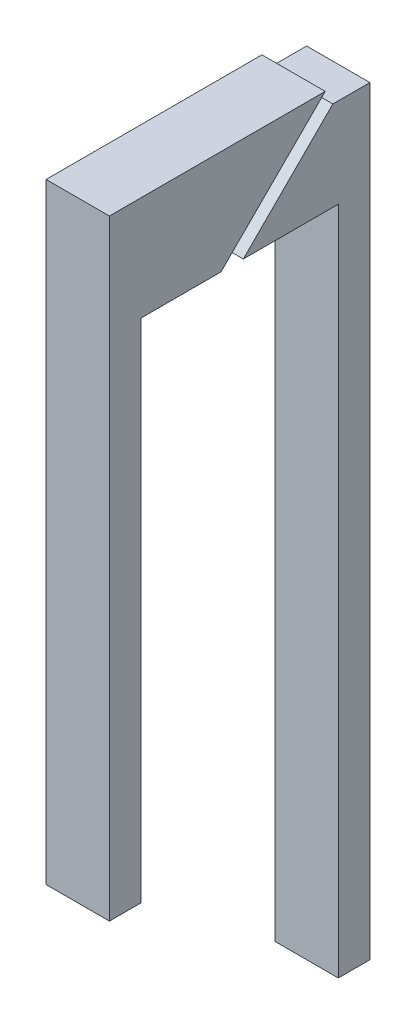
ISO-10303-21;
HEADER;
FILE_DESCRIPTION(('STEP AP214'),'2;1');
FILE_NAME('part.step','',(''),(''),'','','');
FILE_SCHEMA(('AUTOMOTIVE_DESIGN { 1 0 10303 214 1 1 1 1 }'));
ENDSEC;
DATA;
#1=APPLICATION_CONTEXT('core data for automotive mechanical design processes');
#2=APPLICATION_PROTOCOL_DEFINITION('international standard','automotive_design',2000,#1);
#3=PRODUCT_CONTEXT('',#1,'mechanical');
#4=PRODUCT('Part','Part','',(#3));
#5=PRODUCT_RELATED_PRODUCT_CATEGORY('part','',(#4));
#6=PRODUCT_DEFINITION_FORMATION('','',#4);
#7=PRODUCT_DEFINITION_CONTEXT('part definition',#1,'design');
#8=PRODUCT_DEFINITION('design','',#6,#7);
#9=PRODUCT_DEFINITION_SHAPE('','',#8);
#10=(LENGTH_UNIT() NAMED_UNIT(*) SI_UNIT(.MILLI.,.METRE.));
#11=(NAMED_UNIT(*) PLANE_ANGLE_UNIT() SI_UNIT($,.RADIAN.));
#12=(NAMED_UNIT(*) SI_UNIT($,.STERADIAN.) SOLID_ANGLE_UNIT());
#13=UNCERTAINTY_MEASURE_WITH_UNIT(LENGTH_MEASURE(1.E-05),#10,'distance_accuracy_value','');
#14=(GEOMETRIC_REPRESENTATION_CONTEXT(3) GLOBAL_UNCERTAINTY_ASSIGNED_CONTEXT((#13)) GLOBAL_UNIT_ASSIGNED_CONTEXT((#10,
#11,#12)) REPRESENTATION_CONTEXT('',''));
#15=CARTESIAN_POINT('',(0.,0.,0.));
#16=DIRECTION('',(0.,0.,1.));
#17=DIRECTION('',(1.,0.,0.));
#18=AXIS2_PLACEMENT_3D('',#15,#16,#17);
#19=CARTESIAN_POINT('',(1.,-32.4711166692554,-20.6743711676793));
#20=DIRECTION('',(0.,-1.,0.));
#21=DIRECTION('',(0.,0.,-1.));
#22=AXIS2_PLACEMENT_3D('',#19,#20,#21);
#23=PLANE('',#22);
#24=DIRECTION('',(0.,0.,1.));
#25=VECTOR('',#24,1.);
#26=CARTESIAN_POINT('',(0.,-32.4711166692554,-20.6743711676793));
#27=LINE('',#26,#25);
#28=CARTESIAN_POINT('',(0.,-32.4711166692554,-24.0837299023369));
#29=VERTEX_POINT('',#28);
#30=CARTESIAN_POINT('',(0.,-32.4711166692554,-20.6743711676793));
#31=VERTEX_POINT('',#30);
#32=EDGE_CURVE('E127',#29,#31,#27,.T.);
#33=ORIENTED_EDGE('',*,*,#32,.T.);
#34=DIRECTION('',(-1.,0.,0.));
#35=VECTOR('',#34,1.);
#36=CARTESIAN_POINT('',(1.,-32.4711166692554,-20.6743711676793));
#37=LINE('',#36,#35);
#38=CARTESIAN_POINT('',(1.,-32.4711166692554,-20.6743711676793));
#39=VERTEX_POINT('',#38);
#40=EDGE_CURVE('E12',#39,#31,#37,.T.);
#41=ORIENTED_EDGE('',*,*,#40,.F.);
#42=DIRECTION('',(0.,0.,1.));
#43=VECTOR('',#42,1.);
#44=CARTESIAN_POINT('',(1.,-32.4711166692554,-20.6743711676793));
#45=LINE('',#44,#43);
#46=CARTESIAN_POINT('',(1.,-32.4711166692554,-24.0837299023369));
#47=VERTEX_POINT('',#46);
#48=EDGE_CURVE('E137',#47,#39,#45,.T.);
#49=ORIENTED_EDGE('',*,*,#48,.F.);
#50=DIRECTION('',(-1.,0.,0.));
#51=VECTOR('',#50,1.);
#52=CARTESIAN_POINT('',(1.,-32.4711166692554,-24.0837299023369));
#53=LINE('',#52,#51);
#54=EDGE_CURVE('E123',#47,#29,#53,.T.);
#55=ORIENTED_EDGE('',*,*,#54,.T.);
#56=EDGE_LOOP('',(#33,#41,#49,#55));
#57=FACE_BOUND('',#56,.T.);
#58=ADVANCED_FACE('F43',(#57),#23,.F.);
#59=CARTESIAN_POINT('',(1.,-42.1175184791234,-20.6743711676793));
#60=DIRECTION('',(0.,0.,-1.));
#61=DIRECTION('',(-1.,0.,0.));
#62=AXIS2_PLACEMENT_3D('',#59,#60,#61);
#63=PLANE('',#62);
#64=DIRECTION('',(0.,-1.,0.));
#65=VECTOR('',#64,1.);
#66=CARTESIAN_POINT('',(0.,-42.1175184791234,-20.6743711676793));
#67=LINE('',#66,#65);
#68=CARTESIAN_POINT('',(0.,-42.1175184791234,-20.6743711676793));
#69=VERTEX_POINT('',#68);
#70=EDGE_CURVE('E130',#31,#69,#67,.T.);
#71=ORIENTED_EDGE('',*,*,#70,.T.);
#72=DIRECTION('',(-1.,0.,0.));
#73=VECTOR('',#72,1.);
#74=CARTESIAN_POINT('',(1.,-42.1175184791234,-20.6743711676793));
#75=LINE('',#74,#73);
#76=CARTESIAN_POINT('',(1.,-42.1175184791234,-20.6743711676793));
#77=VERTEX_POINT('',#76);
#78=EDGE_CURVE('E51',#77,#69,#75,.T.);
#79=ORIENTED_EDGE('',*,*,#78,.F.);
#80=DIRECTION('',(0.,-1.,0.));
#81=VECTOR('',#80,1.);
#82=CARTESIAN_POINT('',(1.,-42.1175184791234,-20.6743711676793));
#83=LINE('',#82,#81);
#84=EDGE_CURVE('E96',#39,#77,#83,.T.);
#85=ORIENTED_EDGE('',*,*,#84,.F.);
#86=ORIENTED_EDGE('',*,*,#40,.T.);
#87=EDGE_LOOP('',(#71,#79,#85,#86));
#88=FACE_BOUND('',#87,.T.);
#89=ADVANCED_FACE('F161',(#88),#63,.F.);
#90=CARTESIAN_POINT('',(1.,-42.1175184791234,-21.1743711676793));
#91=DIRECTION('',(0.,1.,0.));
#92=DIRECTION('',(0.,0.,1.));
#93=AXIS2_PLACEMENT_3D('',#90,#91,#92);
#94=PLANE('',#93);
#95=DIRECTION('',(0.,0.,-1.));
#96=VECTOR('',#95,1.);
#97=CARTESIAN_POINT('',(0.,-42.1175184791234,-21.1743711676793));
#98=LINE('',#97,#96);
#99=CARTESIAN_POINT('',(0.,-42.1175184791234,-21.1743711676793));
#100=VERTEX_POINT('',#99);
#101=EDGE_CURVE('E132',#69,#100,#98,.T.);
#102=ORIENTED_EDGE('',*,*,#101,.T.);
#103=DIRECTION('',(-1.,0.,0.));
#104=VECTOR('',#103,1.);
#105=CARTESIAN_POINT('',(1.,-42.1175184791234,-21.1743711676793));
#106=LINE('',#105,#104);
#107=CARTESIAN_POINT('',(1.,-42.1175184791234,-21.1743711676793));
#108=VERTEX_POINT('',#107);
#109=EDGE_CURVE('E118',#108,#100,#106,.T.);
#110=ORIENTED_EDGE('',*,*,#109,.F.);
#111=DIRECTION('',(0.,0.,-1.));
#112=VECTOR('',#111,1.);
#113=CARTESIAN_POINT('',(1.,-42.1175184791234,-21.1743711676793));
#114=LINE('',#113,#112);
#115=EDGE_CURVE('E109',#77,#108,#114,.T.);
#116=ORIENTED_EDGE('',*,*,#115,.F.);
#117=ORIENTED_EDGE('',*,*,#78,.T.);
#118=EDGE_LOOP('',(#102,#110,#116,#117));
#119=FACE_BOUND('',#118,.T.);
#120=ADVANCED_FACE('F143',(#119),#94,.F.);
#121=CARTESIAN_POINT('',(1.,-34.1175184791234,-21.1743711676793));
#122=DIRECTION('',(0.,0.,1.));
#123=DIRECTION('',(1.,0.,0.));
#124=AXIS2_PLACEMENT_3D('',#121,#122,#123);
#125=PLANE('',#124);
#126=DIRECTION('',(0.,1.,0.));
#127=VECTOR('',#126,1.);
#128=CARTESIAN_POINT('',(0.,-34.1175184791234,-21.1743711676793));
#129=LINE('',#128,#127);
#130=CARTESIAN_POINT('',(0.,-34.1175184791234,-21.1743711676793));
#131=VERTEX_POINT('',#130);
#132=EDGE_CURVE('E117',#100,#131,#129,.T.);
#133=ORIENTED_EDGE('',*,*,#132,.T.);
#134=DIRECTION('',(-1.,0.,0.));
#135=VECTOR('',#134,1.);
#136=CARTESIAN_POINT('',(1.,-34.1175184791234,-21.1743711676793));
#137=LINE('',#136,#135);
#138=CARTESIAN_POINT('',(1.,-34.1175184791234,-21.1743711676793));
#139=VERTEX_POINT('',#138);
#140=EDGE_CURVE('E114',#139,#131,#137,.T.);
#141=ORIENTED_EDGE('',*,*,#140,.F.);
#142=DIRECTION('',(0.,1.,0.));
#143=VECTOR('',#142,1.);
#144=CARTESIAN_POINT('',(1.,-34.1175184791234,-21.1743711676793));
#145=LINE('',#144,#143);
#146=EDGE_CURVE('E103',#108,#139,#145,.T.);
#147=ORIENTED_EDGE('',*,*,#146,.F.);
#148=ORIENTED_EDGE('',*,*,#109,.T.);
#149=EDGE_LOOP('',(#133,#141,#147,#148));
#150=FACE_BOUND('',#149,.T.);
#151=ADVANCED_FACE('F115',(#150),#125,.F.);
#152=CARTESIAN_POINT('',(1.,-34.1175184791234,-22.4373280924689));
#153=DIRECTION('',(0.,1.,0.));
#154=DIRECTION('',(0.,0.,1.));
#155=AXIS2_PLACEMENT_3D('',#152,#153,#154);
#156=PLANE('',#155);
#157=DIRECTION('',(0.,0.,-1.));
#158=VECTOR('',#157,1.);
#159=CARTESIAN_POINT('',(0.,-34.1175184791234,-22.4373280924689));
#160=LINE('',#159,#158);
#161=CARTESIAN_POINT('',(0.,-34.1175184791234,-22.4373280924689));
#162=VERTEX_POINT('',#161);
#163=EDGE_CURVE('E82',#131,#162,#160,.T.);
#164=ORIENTED_EDGE('',*,*,#163,.T.);
#165=DIRECTION('',(-1.,0.,0.));
#166=VECTOR('',#165,1.);
#167=CARTESIAN_POINT('',(1.,-34.1175184791234,-22.4373280924689));
#168=LINE('',#167,#166);
#169=CARTESIAN_POINT('',(1.,-34.1175184791234,-22.4373280924689));
#170=VERTEX_POINT('',#169);
#171=EDGE_CURVE('E119',#170,#162,#168,.T.);
#172=ORIENTED_EDGE('',*,*,#171,.F.);
#173=DIRECTION('',(0.,0.,-1.));
#174=VECTOR('',#173,1.);
#175=CARTESIAN_POINT('',(1.,-34.1175184791234,-22.4373280924689));
#176=LINE('',#175,#174);
#177=EDGE_CURVE('E107',#139,#170,#176,.T.);
#178=ORIENTED_EDGE('',*,*,#177,.F.);
#179=ORIENTED_EDGE('',*,*,#140,.T.);
#180=EDGE_LOOP('',(#164,#172,#178,#179));
#181=FACE_BOUND('',#180,.T.);
#182=ADVANCED_FACE('F121',(#181),#156,.F.);
#183=CARTESIAN_POINT('',(1.,-32.4711166692554,-24.0837299023369));
#184=DIRECTION('',(0.,0.707106781186547,0.707106781186547));
#185=DIRECTION('',(0.,-0.707106781186548,0.707106781186548));
#186=AXIS2_PLACEMENT_3D('',#183,#184,#185);
#187=PLANE('',#186);
#188=DIRECTION('',(0.,0.707106781186547,-0.707106781186547));
#189=VECTOR('',#188,1.);
#190=CARTESIAN_POINT('',(0.,-32.4711166692554,-24.0837299023369));
#191=LINE('',#190,#189);
#192=EDGE_CURVE('E88',#162,#29,#191,.T.);
#193=ORIENTED_EDGE('',*,*,#192,.T.);
#194=ORIENTED_EDGE('',*,*,#54,.F.);
#195=DIRECTION('',(0.,0.707106781186547,-0.707106781186547));
#196=VECTOR('',#195,1.);
#197=CARTESIAN_POINT('',(1.,-32.4711166692554,-24.0837299023369));
#198=LINE('',#197,#196);
#199=EDGE_CURVE('E59',#170,#47,#198,.T.);
#200=ORIENTED_EDGE('',*,*,#199,.F.);
#201=ORIENTED_EDGE('',*,*,#171,.T.);
#202=EDGE_LOOP('',(#193,#194,#200,#201));
#203=FACE_BOUND('',#202,.T.);
#204=ADVANCED_FACE('F150',(#203),#187,.F.);
#205=CARTESIAN_POINT('',(1.,0.,0.));
#206=DIRECTION('',(-1.,0.,0.));
#207=DIRECTION('',(0.,0.,1.));
#208=AXIS2_PLACEMENT_3D('',#205,#206,#207);
#209=PLANE('',#208);
#210=ORIENTED_EDGE('',*,*,#48,.T.);
#211=ORIENTED_EDGE('',*,*,#84,.T.);
#212=ORIENTED_EDGE('',*,*,#115,.T.);
#213=ORIENTED_EDGE('',*,*,#146,.T.);
#214=ORIENTED_EDGE('',*,*,#177,.T.);
#215=ORIENTED_EDGE('',*,*,#199,.T.);
#216=EDGE_LOOP('',(#210,#211,#212,#213,#214,#215));
#217=FACE_BOUND('',#216,.T.);
#218=ADVANCED_FACE('F105',(#217),#209,.F.);
#219=CARTESIAN_POINT('',(0.,0.,0.));
#220=DIRECTION('',(-1.,0.,0.));
#221=DIRECTION('',(0.,0.,1.));
#222=AXIS2_PLACEMENT_3D('',#219,#220,#221);
#223=PLANE('',#222);
#224=ORIENTED_EDGE('',*,*,#32,.F.);
#225=ORIENTED_EDGE('',*,*,#192,.F.);
#226=ORIENTED_EDGE('',*,*,#163,.F.);
#227=ORIENTED_EDGE('',*,*,#132,.F.);
#228=ORIENTED_EDGE('',*,*,#101,.F.);
#229=ORIENTED_EDGE('',*,*,#70,.F.);
#230=EDGE_LOOP('',(#224,#225,#226,#227,#228,#229));
#231=FACE_BOUND('',#230,.T.);
#232=ADVANCED_FACE('F146',(#231),#223,.T.);
#233=CLOSED_SHELL('',(#58,#89,#120,#151,#182,#204,#218,#232));
#234=MANIFOLD_SOLID_BREP('B2',#233);
#235=CARTESIAN_POINT('',(1.,-32.7033049167503,-24.7898441171594));
#236=DIRECTION('',(0.,-1.,0.));
#237=DIRECTION('',(0.,0.,-1.));
#238=AXIS2_PLACEMENT_3D('',#235,#236,#237);
#239=PLANE('',#238);
#240=DIRECTION('',(0.,0.,1.));
#241=VECTOR('',#240,1.);
#242=CARTESIAN_POINT('',(0.,-32.7033049167503,-24.7898441171594));
#243=LINE('',#242,#241);
#244=CARTESIAN_POINT('',(0.,-32.7033049167503,-24.7898441171594));
#245=VERTEX_POINT('',#244);
#246=CARTESIAN_POINT('',(0.,-32.7033049167503,-24.2040576795325));
#247=VERTEX_POINT('',#246);
#248=EDGE_CURVE('E303',#245,#247,#243,.T.);
#249=ORIENTED_EDGE('',*,*,#248,.T.);
#250=DIRECTION('',(-1.,0.,0.));
#251=VECTOR('',#250,1.);
#252=CARTESIAN_POINT('',(1.,-32.7033049167503,-24.2040576795325));
#253=LINE('',#252,#251);
#254=CARTESIAN_POINT('',(1.,-32.7033049167503,-24.2040576795325));
#255=VERTEX_POINT('',#254);
#256=EDGE_CURVE('E41',#255,#247,#253,.T.);
#257=ORIENTED_EDGE('',*,*,#256,.F.);
#258=DIRECTION('',(0.,0.,1.));
#259=VECTOR('',#258,1.);
#260=CARTESIAN_POINT('',(1.,-32.7033049167503,-24.7898441171594));
#261=LINE('',#260,#259);
#262=CARTESIAN_POINT('',(1.,-32.7033049167503,-24.7898441171594));
#263=VERTEX_POINT('',#262);
#264=EDGE_CURVE('E313',#263,#255,#261,.T.);
#265=ORIENTED_EDGE('',*,*,#264,.F.);
#266=DIRECTION('',(-1.,0.,0.));
#267=VECTOR('',#266,1.);
#268=CARTESIAN_POINT('',(1.,-32.7033049167503,-24.7898441171594));
#269=LINE('',#268,#267);
#270=EDGE_CURVE('E299',#263,#245,#269,.T.);
#271=ORIENTED_EDGE('',*,*,#270,.T.);
#272=EDGE_LOOP('',(#249,#257,#265,#271));
#273=FACE_BOUND('',#272,.T.);
#274=ADVANCED_FACE('F219',(#273),#239,.F.);
#275=CARTESIAN_POINT('',(1.,-32.7033049167503,-24.2040576795325));
#276=DIRECTION('',(0.,-0.707106781186547,-0.707106781186547));
#277=DIRECTION('',(0.,0.707106781186548,-0.707106781186548));
#278=AXIS2_PLACEMENT_3D('',#275,#276,#277);
#279=PLANE('',#278);
#280=DIRECTION('',(0.,-0.707106781186548,0.707106781186548));
#281=VECTOR('',#280,1.);
#282=CARTESIAN_POINT('',(0.,-32.7033049167503,-24.2040576795325));
#283=LINE('',#282,#281);
#284=CARTESIAN_POINT('',(0.,-34.1175184791234,-22.7898441171594));
#285=VERTEX_POINT('',#284);
#286=EDGE_CURVE('E306',#247,#285,#283,.T.);
#287=ORIENTED_EDGE('',*,*,#286,.T.);
#288=DIRECTION('',(-1.,0.,0.));
#289=VECTOR('',#288,1.);
#290=CARTESIAN_POINT('',(1.,-34.1175184791234,-22.7898441171594));
#291=LINE('',#290,#289);
#292=CARTESIAN_POINT('',(1.,-34.1175184791234,-22.7898441171594));
#293=VERTEX_POINT('',#292);
#294=EDGE_CURVE('E227',#293,#285,#291,.T.);
#295=ORIENTED_EDGE('',*,*,#294,.F.);
#296=DIRECTION('',(0.,-0.707106781186548,0.707106781186548));
#297=VECTOR('',#296,1.);
#298=CARTESIAN_POINT('',(1.,-32.7033049167503,-24.2040576795325));
#299=LINE('',#298,#297);
#300=EDGE_CURVE('E272',#255,#293,#299,.T.);
#301=ORIENTED_EDGE('',*,*,#300,.F.);
#302=ORIENTED_EDGE('',*,*,#256,.T.);
#303=EDGE_LOOP('',(#287,#295,#301,#302));
#304=FACE_BOUND('',#303,.T.);
#305=ADVANCED_FACE('F337',(#304),#279,.F.);
#306=CARTESIAN_POINT('',(1.,-34.1175184791234,-22.7898441171594));
#307=DIRECTION('',(0.,1.,0.));
#308=DIRECTION('',(0.,0.,1.));
#309=AXIS2_PLACEMENT_3D('',#306,#307,#308);
#310=PLANE('',#309);
#311=DIRECTION('',(0.,0.,-1.));
#312=VECTOR('',#311,1.);
#313=CARTESIAN_POINT('',(0.,-34.1175184791234,-22.7898441171594));
#314=LINE('',#313,#312);
#315=CARTESIAN_POINT('',(0.,-34.1175184791234,-24.2898441171594));
#316=VERTEX_POINT('',#315);
#317=EDGE_CURVE('E308',#285,#316,#314,.T.);
#318=ORIENTED_EDGE('',*,*,#317,.T.);
#319=DIRECTION('',(-1.,0.,0.));
#320=VECTOR('',#319,1.);
#321=CARTESIAN_POINT('',(1.,-34.1175184791234,-24.2898441171594));
#322=LINE('',#321,#320);
#323=CARTESIAN_POINT('',(1.,-34.1175184791234,-24.2898441171594));
#324=VERTEX_POINT('',#323);
#325=EDGE_CURVE('E294',#324,#316,#322,.T.);
#326=ORIENTED_EDGE('',*,*,#325,.F.);
#327=DIRECTION('',(0.,0.,-1.));
#328=VECTOR('',#327,1.);
#329=CARTESIAN_POINT('',(1.,-34.1175184791234,-22.7898441171594));
#330=LINE('',#329,#328);
#331=EDGE_CURVE('E285',#293,#324,#330,.T.);
#332=ORIENTED_EDGE('',*,*,#331,.F.);
#333=ORIENTED_EDGE('',*,*,#294,.T.);
#334=EDGE_LOOP('',(#318,#326,#332,#333));
#335=FACE_BOUND('',#334,.T.);
#336=ADVANCED_FACE('F319',(#335),#310,.F.);
#337=CARTESIAN_POINT('',(1.,-34.1175184791234,-24.2898441171594));
#338=DIRECTION('',(0.,0.,-1.));
#339=DIRECTION('',(-1.,0.,0.));
#340=AXIS2_PLACEMENT_3D('',#337,#338,#339);
#341=PLANE('',#340);
#342=DIRECTION('',(0.,-1.,0.));
#343=VECTOR('',#342,1.);
#344=CARTESIAN_POINT('',(0.,-34.1175184791234,-24.2898441171594));
#345=LINE('',#344,#343);
#346=CARTESIAN_POINT('',(0.,-44.7033049167503,-24.2898441171594));
#347=VERTEX_POINT('',#346);
#348=EDGE_CURVE('E293',#316,#347,#345,.T.);
#349=ORIENTED_EDGE('',*,*,#348,.T.);
#350=DIRECTION('',(-1.,0.,0.));
#351=VECTOR('',#350,1.);
#352=CARTESIAN_POINT('',(1.,-44.7033049167503,-24.2898441171594));
#353=LINE('',#352,#351);
#354=CARTESIAN_POINT('',(1.,-44.7033049167503,-24.2898441171594));
#355=VERTEX_POINT('',#354);
#356=EDGE_CURVE('E290',#355,#347,#353,.T.);
#357=ORIENTED_EDGE('',*,*,#356,.F.);
#358=DIRECTION('',(0.,-1.,0.));
#359=VECTOR('',#358,1.);
#360=CARTESIAN_POINT('',(1.,-34.1175184791234,-24.2898441171594));
#361=LINE('',#360,#359);
#362=EDGE_CURVE('E279',#324,#355,#361,.T.);
#363=ORIENTED_EDGE('',*,*,#362,.F.);
#364=ORIENTED_EDGE('',*,*,#325,.T.);
#365=EDGE_LOOP('',(#349,#357,#363,#364));
#366=FACE_BOUND('',#365,.T.);
#367=ADVANCED_FACE('F291',(#366),#341,.F.);
#368=CARTESIAN_POINT('',(1.,-44.7033049167503,-24.2898441171594));
#369=DIRECTION('',(0.,1.,0.));
#370=DIRECTION('',(0.,0.,1.));
#371=AXIS2_PLACEMENT_3D('',#368,#369,#370);
#372=PLANE('',#371);
#373=DIRECTION('',(0.,0.,-1.));
#374=VECTOR('',#373,1.);
#375=CARTESIAN_POINT('',(0.,-44.7033049167503,-24.2898441171594));
#376=LINE('',#375,#374);
#377=CARTESIAN_POINT('',(0.,-44.7033049167503,-24.7898441171594));
#378=VERTEX_POINT('',#377);
#379=EDGE_CURVE('E258',#347,#378,#376,.T.);
#380=ORIENTED_EDGE('',*,*,#379,.T.);
#381=DIRECTION('',(-1.,0.,0.));
#382=VECTOR('',#381,1.);
#383=CARTESIAN_POINT('',(1.,-44.7033049167503,-24.7898441171594));
#384=LINE('',#383,#382);
#385=CARTESIAN_POINT('',(1.,-44.7033049167503,-24.7898441171594));
#386=VERTEX_POINT('',#385);
#387=EDGE_CURVE('E295',#386,#378,#384,.T.);
#388=ORIENTED_EDGE('',*,*,#387,.F.);
#389=DIRECTION('',(0.,0.,-1.));
#390=VECTOR('',#389,1.);
#391=CARTESIAN_POINT('',(1.,-44.7033049167503,-24.2898441171594));
#392=LINE('',#391,#390);
#393=EDGE_CURVE('E283',#355,#386,#392,.T.);
#394=ORIENTED_EDGE('',*,*,#393,.F.);
#395=ORIENTED_EDGE('',*,*,#356,.T.);
#396=EDGE_LOOP('',(#380,#388,#394,#395));
#397=FACE_BOUND('',#396,.T.);
#398=ADVANCED_FACE('F297',(#397),#372,.F.);
#399=CARTESIAN_POINT('',(1.,-44.7033049167503,-24.7898441171594));
#400=DIRECTION('',(0.,0.,1.));
#401=DIRECTION('',(1.,0.,0.));
#402=AXIS2_PLACEMENT_3D('',#399,#400,#401);
#403=PLANE('',#402);
#404=DIRECTION('',(0.,1.,0.));
#405=VECTOR('',#404,1.);
#406=CARTESIAN_POINT('',(0.,-44.7033049167503,-24.7898441171594));
#407=LINE('',#406,#405);
#408=EDGE_CURVE('E264',#378,#245,#407,.T.);
#409=ORIENTED_EDGE('',*,*,#408,.T.);
#410=ORIENTED_EDGE('',*,*,#270,.F.);
#411=DIRECTION('',(0.,1.,0.));
#412=VECTOR('',#411,1.);
#413=CARTESIAN_POINT('',(1.,-44.7033049167503,-24.7898441171594));
#414=LINE('',#413,#412);
#415=EDGE_CURVE('E235',#386,#263,#414,.T.);
#416=ORIENTED_EDGE('',*,*,#415,.F.);
#417=ORIENTED_EDGE('',*,*,#387,.T.);
#418=EDGE_LOOP('',(#409,#410,#416,#417));
#419=FACE_BOUND('',#418,.T.);
#420=ADVANCED_FACE('F326',(#419),#403,.F.);
#421=CARTESIAN_POINT('',(1.,0.,0.));
#422=DIRECTION('',(1.,0.,0.));
#423=DIRECTION('',(0.,0.,-1.));
#424=AXIS2_PLACEMENT_3D('',#421,#422,#423);
#425=PLANE('',#424);
#426=ORIENTED_EDGE('',*,*,#264,.T.);
#427=ORIENTED_EDGE('',*,*,#300,.T.);
#428=ORIENTED_EDGE('',*,*,#331,.T.);
#429=ORIENTED_EDGE('',*,*,#362,.T.);
#430=ORIENTED_EDGE('',*,*,#393,.T.);
#431=ORIENTED_EDGE('',*,*,#415,.T.);
#432=EDGE_LOOP('',(#426,#427,#428,#429,#430,#431));
#433=FACE_BOUND('',#432,.T.);
#434=ADVANCED_FACE('F281',(#433),#425,.T.);
#435=CARTESIAN_POINT('',(0.,0.,0.));
#436=DIRECTION('',(1.,0.,0.));
#437=DIRECTION('',(0.,0.,-1.));
#438=AXIS2_PLACEMENT_3D('',#435,#436,#437);
#439=PLANE('',#438);
#440=ORIENTED_EDGE('',*,*,#248,.F.);
#441=ORIENTED_EDGE('',*,*,#408,.F.);
#442=ORIENTED_EDGE('',*,*,#379,.F.);
#443=ORIENTED_EDGE('',*,*,#348,.F.);
#444=ORIENTED_EDGE('',*,*,#317,.F.);
#445=ORIENTED_EDGE('',*,*,#286,.F.);
#446=EDGE_LOOP('',(#440,#441,#442,#443,#444,#445));
#447=FACE_BOUND('',#446,.T.);
#448=ADVANCED_FACE('F322',(#447),#439,.F.);
#449=CLOSED_SHELL('',(#274,#305,#336,#367,#398,#420,#434,#448));
#450=MANIFOLD_SOLID_BREP('B6',#449);
#451=ADVANCED_BREP_SHAPE_REPRESENTATION('',(#18,#234,#450),#14);
#452=SHAPE_DEFINITION_REPRESENTATION(#9,#451);
ENDSEC;
END-ISO-10303-21;
